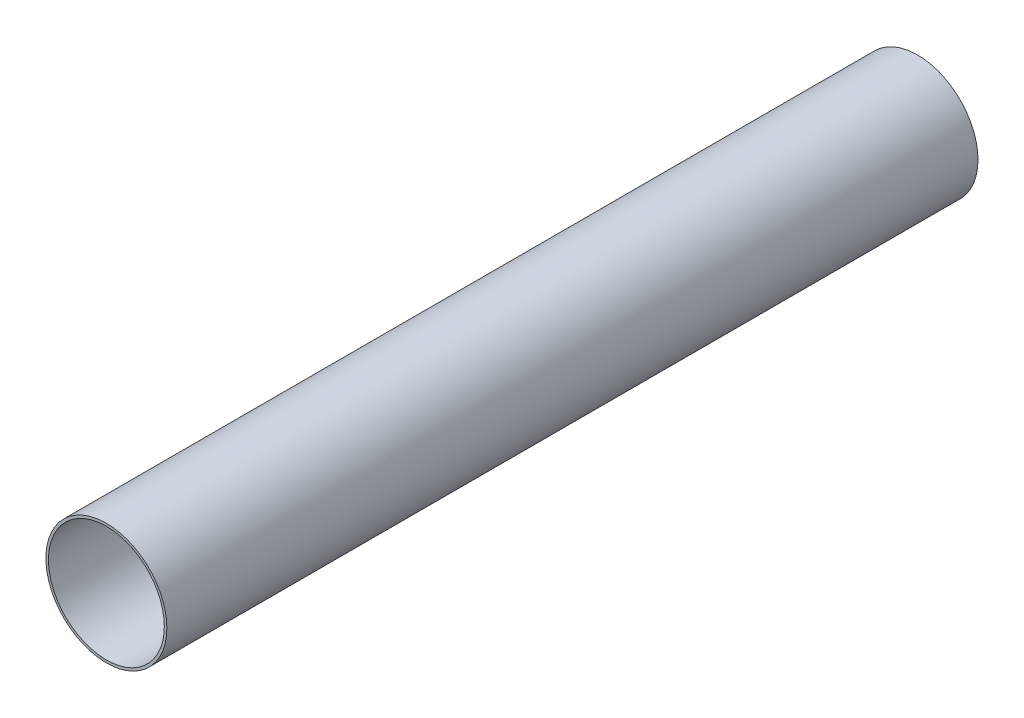
ISO-10303-21;
HEADER;
FILE_DESCRIPTION(('STEP AP214'),'2;1');
FILE_NAME('part.step','',(''),(''),'','','');
FILE_SCHEMA(('AUTOMOTIVE_DESIGN { 1 0 10303 214 1 1 1 1 }'));
ENDSEC;
DATA;
#1=APPLICATION_CONTEXT('core data for automotive mechanical design processes');
#2=APPLICATION_PROTOCOL_DEFINITION('international standard','automotive_design',2000,#1);
#3=PRODUCT_CONTEXT('',#1,'mechanical');
#4=PRODUCT('Part','Part','',(#3));
#5=PRODUCT_RELATED_PRODUCT_CATEGORY('part','',(#4));
#6=PRODUCT_DEFINITION_FORMATION('','',#4);
#7=PRODUCT_DEFINITION_CONTEXT('part definition',#1,'design');
#8=PRODUCT_DEFINITION('design','',#6,#7);
#9=PRODUCT_DEFINITION_SHAPE('','',#8);
#10=(LENGTH_UNIT() NAMED_UNIT(*) SI_UNIT(.MILLI.,.METRE.));
#11=(NAMED_UNIT(*) PLANE_ANGLE_UNIT() SI_UNIT($,.RADIAN.));
#12=(NAMED_UNIT(*) SI_UNIT($,.STERADIAN.) SOLID_ANGLE_UNIT());
#13=UNCERTAINTY_MEASURE_WITH_UNIT(LENGTH_MEASURE(1.E-05),#10,'distance_accuracy_value','');
#14=(GEOMETRIC_REPRESENTATION_CONTEXT(3) GLOBAL_UNCERTAINTY_ASSIGNED_CONTEXT((#13)) GLOBAL_UNIT_ASSIGNED_CONTEXT((#10,
#11,#12)) REPRESENTATION_CONTEXT('',''));
#15=CARTESIAN_POINT('',(0.,0.,0.));
#16=DIRECTION('',(0.,0.,1.));
#17=DIRECTION('',(1.,0.,0.));
#18=AXIS2_PLACEMENT_3D('',#15,#16,#17);
#19=CARTESIAN_POINT('',(0.,0.,177.8));
#20=DIRECTION('',(0.,0.,1.));
#21=DIRECTION('',(1.,0.,0.));
#22=AXIS2_PLACEMENT_3D('',#19,#20,#21);
#23=PLANE('',#22);
#24=CARTESIAN_POINT('',(0.,0.,177.8));
#25=DIRECTION('',(0.,0.,1.));
#26=DIRECTION('',(1.,0.,0.));
#27=AXIS2_PLACEMENT_3D('',#24,#25,#26);
#28=CIRCLE('',#27,26.516477777978);
#29=CARTESIAN_POINT('',(26.516477777978,0.,177.8));
#30=VERTEX_POINT('',#29);
#31=EDGE_CURVE('E10',#30,#30,#28,.T.);
#32=ORIENTED_EDGE('',*,*,#31,.T.);
#33=EDGE_LOOP('',(#32));
#34=FACE_BOUND('',#33,.T.);
#35=CARTESIAN_POINT('',(0.,0.,177.8));
#36=DIRECTION('',(0.,0.,1.));
#37=DIRECTION('',(1.,0.,0.));
#38=AXIS2_PLACEMENT_3D('',#35,#36,#37);
#39=CIRCLE('',#38,25.4);
#40=CARTESIAN_POINT('',(25.4,0.,177.8));
#41=VERTEX_POINT('',#40);
#42=EDGE_CURVE('E54',#41,#41,#39,.T.);
#43=ORIENTED_EDGE('',*,*,#42,.F.);
#44=EDGE_LOOP('',(#43));
#45=FACE_BOUND('',#44,.T.);
#46=ADVANCED_FACE('F41',(#34,#45),#23,.T.);
#47=CARTESIAN_POINT('',(0.,0.,-177.8));
#48=DIRECTION('',(0.,0.,1.));
#49=DIRECTION('',(1.,0.,0.));
#50=AXIS2_PLACEMENT_3D('',#47,#48,#49);
#51=PLANE('',#50);
#52=CARTESIAN_POINT('',(0.,0.,-177.8));
#53=DIRECTION('',(0.,0.,1.));
#54=DIRECTION('',(1.,0.,0.));
#55=AXIS2_PLACEMENT_3D('',#52,#53,#54);
#56=CIRCLE('',#55,26.516477777978);
#57=CARTESIAN_POINT('',(26.516477777978,0.,-177.8));
#58=VERTEX_POINT('',#57);
#59=EDGE_CURVE('E45',#58,#58,#56,.T.);
#60=ORIENTED_EDGE('',*,*,#59,.F.);
#61=EDGE_LOOP('',(#60));
#62=FACE_BOUND('',#61,.T.);
#63=CARTESIAN_POINT('',(0.,0.,-177.8));
#64=DIRECTION('',(0.,0.,1.));
#65=DIRECTION('',(1.,0.,0.));
#66=AXIS2_PLACEMENT_3D('',#63,#64,#65);
#67=CIRCLE('',#66,25.4);
#68=CARTESIAN_POINT('',(25.4,0.,-177.8));
#69=VERTEX_POINT('',#68);
#70=EDGE_CURVE('E56',#69,#69,#67,.T.);
#71=ORIENTED_EDGE('',*,*,#70,.T.);
#72=EDGE_LOOP('',(#71));
#73=FACE_BOUND('',#72,.T.);
#74=ADVANCED_FACE('F68',(#62,#73),#51,.F.);
#75=CARTESIAN_POINT('',(0.,0.,177.8));
#76=DIRECTION('',(0.,0.,-1.));
#77=DIRECTION('',(-1.,0.,0.));
#78=AXIS2_PLACEMENT_3D('',#75,#76,#77);
#79=CYLINDRICAL_SURFACE('',#78,26.516477777978);
#80=ORIENTED_EDGE('',*,*,#31,.F.);
#81=EDGE_LOOP('',(#80));
#82=FACE_BOUND('',#81,.T.);
#83=ORIENTED_EDGE('',*,*,#59,.T.);
#84=EDGE_LOOP('',(#83));
#85=FACE_BOUND('',#84,.T.);
#86=ADVANCED_FACE('F43',(#82,#85),#79,.T.);
#87=CARTESIAN_POINT('',(0.,0.,177.8));
#88=DIRECTION('',(0.,0.,-1.));
#89=DIRECTION('',(-1.,0.,0.));
#90=AXIS2_PLACEMENT_3D('',#87,#88,#89);
#91=CYLINDRICAL_SURFACE('',#90,25.4);
#92=ORIENTED_EDGE('',*,*,#42,.T.);
#93=EDGE_LOOP('',(#92));
#94=FACE_BOUND('',#93,.T.);
#95=ORIENTED_EDGE('',*,*,#70,.F.);
#96=EDGE_LOOP('',(#95));
#97=FACE_BOUND('',#96,.T.);
#98=ADVANCED_FACE('F64',(#94,#97),#91,.F.);
#99=CLOSED_SHELL('',(#46,#74,#86,#98));
#100=MANIFOLD_SOLID_BREP('B2',#99);
#101=ADVANCED_BREP_SHAPE_REPRESENTATION('',(#18,#100),#14);
#102=SHAPE_DEFINITION_REPRESENTATION(#9,#101);
ENDSEC;
END-ISO-10303-21;
